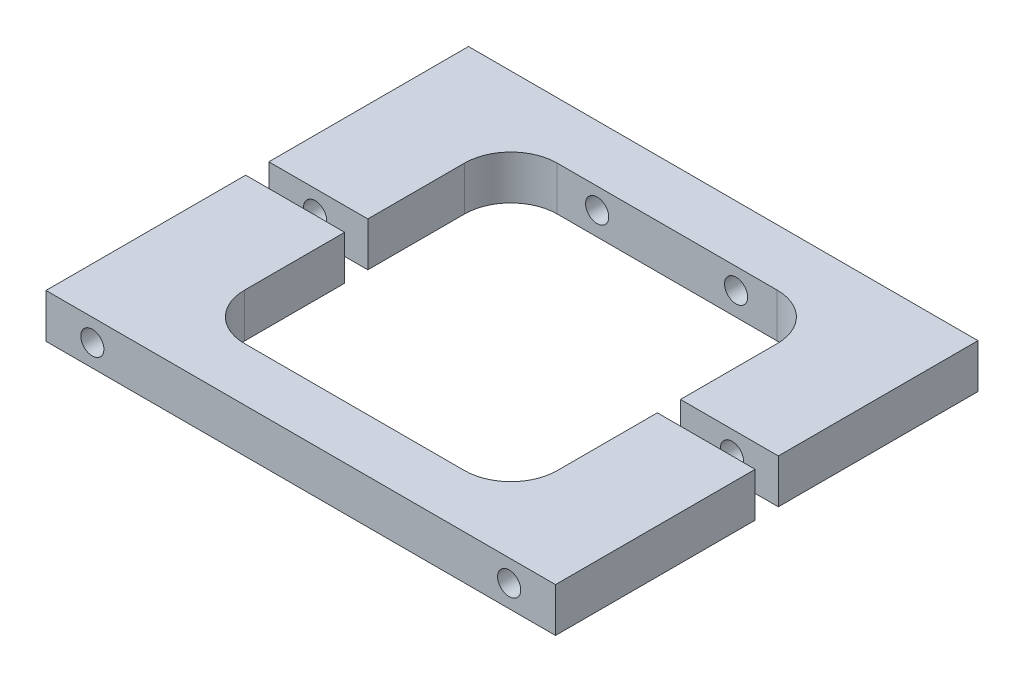
ISO-10303-21;
HEADER;
FILE_DESCRIPTION(('STEP AP214'),'2;1');
FILE_NAME('part.step','',(''),(''),'','','');
FILE_SCHEMA(('AUTOMOTIVE_DESIGN { 1 0 10303 214 1 1 1 1 }'));
ENDSEC;
DATA;
#1=APPLICATION_CONTEXT('core data for automotive mechanical design processes');
#2=APPLICATION_PROTOCOL_DEFINITION('international standard','automotive_design',2000,#1);
#3=PRODUCT_CONTEXT('',#1,'mechanical');
#4=PRODUCT('Part','Part','',(#3));
#5=PRODUCT_RELATED_PRODUCT_CATEGORY('part','',(#4));
#6=PRODUCT_DEFINITION_FORMATION('','',#4);
#7=PRODUCT_DEFINITION_CONTEXT('part definition',#1,'design');
#8=PRODUCT_DEFINITION('design','',#6,#7);
#9=PRODUCT_DEFINITION_SHAPE('','',#8);
#10=(LENGTH_UNIT() NAMED_UNIT(*) SI_UNIT(.MILLI.,.METRE.));
#11=(NAMED_UNIT(*) PLANE_ANGLE_UNIT() SI_UNIT($,.RADIAN.));
#12=(NAMED_UNIT(*) SI_UNIT($,.STERADIAN.) SOLID_ANGLE_UNIT());
#13=UNCERTAINTY_MEASURE_WITH_UNIT(LENGTH_MEASURE(1.E-05),#10,'distance_accuracy_value','');
#14=(GEOMETRIC_REPRESENTATION_CONTEXT(3) GLOBAL_UNCERTAINTY_ASSIGNED_CONTEXT((#13)) GLOBAL_UNIT_ASSIGNED_CONTEXT((#10,
#11,#12)) REPRESENTATION_CONTEXT('',''));
#15=CARTESIAN_POINT('',(0.,0.,0.));
#16=DIRECTION('',(0.,0.,1.));
#17=DIRECTION('',(1.,0.,0.));
#18=AXIS2_PLACEMENT_3D('',#15,#16,#17);
#19=CARTESIAN_POINT('',(-55.,0.,-46.22));
#20=DIRECTION('',(0.,0.,-1.));
#21=DIRECTION('',(-1.,0.,0.));
#22=AXIS2_PLACEMENT_3D('',#19,#20,#21);
#23=PLANE('',#22);
#24=CARTESIAN_POINT('',(45.,4.75999999999999,-46.22));
#25=DIRECTION('',(0.,0.,-1.));
#26=DIRECTION('',(-1.,0.,0.));
#27=AXIS2_PLACEMENT_3D('',#24,#25,#26);
#28=CIRCLE('',#27,2.5);
#29=CARTESIAN_POINT('',(42.5,4.75999999999999,-46.22));
#30=VERTEX_POINT('',#29);
#31=EDGE_CURVE('E476',#30,#30,#28,.T.);
#32=ORIENTED_EDGE('',*,*,#31,.F.);
#33=EDGE_LOOP('',(#32));
#34=FACE_BOUND('',#33,.T.);
#35=CARTESIAN_POINT('',(15.,4.99999999999999,-46.22));
#36=DIRECTION('',(0.,0.,-1.));
#37=DIRECTION('',(-1.,0.,0.));
#38=AXIS2_PLACEMENT_3D('',#35,#36,#37);
#39=CIRCLE('',#38,2.5);
#40=CARTESIAN_POINT('',(12.5,4.99999999999999,-46.22));
#41=VERTEX_POINT('',#40);
#42=EDGE_CURVE('E479',#41,#41,#39,.T.);
#43=ORIENTED_EDGE('',*,*,#42,.F.);
#44=EDGE_LOOP('',(#43));
#45=FACE_BOUND('',#44,.T.);
#46=CARTESIAN_POINT('',(-15.,4.99999999999999,-46.22));
#47=DIRECTION('',(0.,0.,1.));
#48=DIRECTION('',(1.,0.,0.));
#49=AXIS2_PLACEMENT_3D('',#46,#47,#48);
#50=CIRCLE('',#49,2.50000000000001);
#51=CARTESIAN_POINT('',(-12.5,4.99999999999999,-46.22));
#52=VERTEX_POINT('',#51);
#53=EDGE_CURVE('E187',#52,#52,#50,.T.);
#54=ORIENTED_EDGE('',*,*,#53,.T.);
#55=EDGE_LOOP('',(#54));
#56=FACE_BOUND('',#55,.T.);
#57=DIRECTION('',(-1.,0.,0.));
#58=VECTOR('',#57,1.);
#59=CARTESIAN_POINT('',(-55.,9.52,-46.22));
#60=LINE('',#59,#58);
#61=CARTESIAN_POINT('',(55.,9.52,-46.22));
#62=VERTEX_POINT('',#61);
#63=CARTESIAN_POINT('',(-55.,9.52,-46.22));
#64=VERTEX_POINT('',#63);
#65=EDGE_CURVE('E164',#62,#64,#60,.T.);
#66=ORIENTED_EDGE('',*,*,#65,.F.);
#67=DIRECTION('',(0.,1.,0.));
#68=VECTOR('',#67,1.);
#69=CARTESIAN_POINT('',(55.,0.,-46.22));
#70=LINE('',#69,#68);
#71=CARTESIAN_POINT('',(55.,0.,-46.22));
#72=VERTEX_POINT('',#71);
#73=EDGE_CURVE('E165',#72,#62,#70,.T.);
#74=ORIENTED_EDGE('',*,*,#73,.F.);
#75=DIRECTION('',(-1.,0.,0.));
#76=VECTOR('',#75,1.);
#77=CARTESIAN_POINT('',(-55.,0.,-46.22));
#78=LINE('',#77,#76);
#79=CARTESIAN_POINT('',(-55.,0.,-46.22));
#80=VERTEX_POINT('',#79);
#81=EDGE_CURVE('E212',#72,#80,#78,.T.);
#82=ORIENTED_EDGE('',*,*,#81,.T.);
#83=DIRECTION('',(0.,1.,0.));
#84=VECTOR('',#83,1.);
#85=CARTESIAN_POINT('',(-55.,0.,-46.22));
#86=LINE('',#85,#84);
#87=EDGE_CURVE('E208',#80,#64,#86,.T.);
#88=ORIENTED_EDGE('',*,*,#87,.T.);
#89=EDGE_LOOP('',(#66,#74,#82,#88));
#90=FACE_BOUND('',#89,.T.);
#91=CARTESIAN_POINT('',(-45.,4.75999999999999,-46.22));
#92=DIRECTION('',(0.,0.,1.));
#93=DIRECTION('',(1.,0.,0.));
#94=AXIS2_PLACEMENT_3D('',#91,#92,#93);
#95=CIRCLE('',#94,2.5);
#96=CARTESIAN_POINT('',(-42.5,4.75999999999999,-46.22));
#97=VERTEX_POINT('',#96);
#98=EDGE_CURVE('E193',#97,#97,#95,.T.);
#99=ORIENTED_EDGE('',*,*,#98,.T.);
#100=EDGE_LOOP('',(#99));
#101=FACE_BOUND('',#100,.T.);
#102=ADVANCED_FACE('F43',(#34,#45,#56,#90,#101),#23,.T.);
#103=CARTESIAN_POINT('',(-23.6275080575199,0.,-33.99498388496));
#104=DIRECTION('',(0.,0.,-1.));
#105=DIRECTION('',(-1.,0.,0.));
#106=AXIS2_PLACEMENT_3D('',#103,#104,#105);
#107=PLANE('',#106);
#108=CARTESIAN_POINT('',(15.,4.99999999999999,-33.99498388496));
#109=DIRECTION('',(0.,0.,-1.));
#110=DIRECTION('',(-1.,0.,0.));
#111=AXIS2_PLACEMENT_3D('',#108,#109,#110);
#112=CIRCLE('',#111,2.5);
#113=CARTESIAN_POINT('',(12.5,4.99999999999999,-33.99498388496));
#114=VERTEX_POINT('',#113);
#115=EDGE_CURVE('E47',#114,#114,#112,.T.);
#116=ORIENTED_EDGE('',*,*,#115,.T.);
#117=EDGE_LOOP('',(#116));
#118=FACE_BOUND('',#117,.T.);
#119=DIRECTION('',(-1.,0.,0.));
#120=VECTOR('',#119,1.);
#121=CARTESIAN_POINT('',(-23.6275080575199,9.52,-33.99498388496));
#122=LINE('',#121,#120);
#123=CARTESIAN_POINT('',(23.8724919424799,9.52,-33.99498388496));
#124=VERTEX_POINT('',#123);
#125=CARTESIAN_POINT('',(-23.6275080575199,9.52,-33.99498388496));
#126=VERTEX_POINT('',#125);
#127=EDGE_CURVE('E220',#124,#126,#122,.T.);
#128=ORIENTED_EDGE('',*,*,#127,.T.);
#129=DIRECTION('',(0.,1.,0.));
#130=VECTOR('',#129,1.);
#131=CARTESIAN_POINT('',(-23.6275080575199,0.,-33.99498388496));
#132=LINE('',#131,#130);
#133=CARTESIAN_POINT('',(-23.6275080575199,0.,-33.99498388496));
#134=VERTEX_POINT('',#133);
#135=EDGE_CURVE('E221',#134,#126,#132,.T.);
#136=ORIENTED_EDGE('',*,*,#135,.F.);
#137=DIRECTION('',(-1.,0.,0.));
#138=VECTOR('',#137,1.);
#139=CARTESIAN_POINT('',(-23.6275080575199,0.,-33.99498388496));
#140=LINE('',#139,#138);
#141=CARTESIAN_POINT('',(23.8724919424799,0.,-33.99498388496));
#142=VERTEX_POINT('',#141);
#143=EDGE_CURVE('E146',#142,#134,#140,.T.);
#144=ORIENTED_EDGE('',*,*,#143,.F.);
#145=DIRECTION('',(0.,1.,0.));
#146=VECTOR('',#145,1.);
#147=CARTESIAN_POINT('',(23.8724919424799,0.,-33.99498388496));
#148=LINE('',#147,#146);
#149=EDGE_CURVE('E144',#142,#124,#148,.T.);
#150=ORIENTED_EDGE('',*,*,#149,.T.);
#151=EDGE_LOOP('',(#128,#136,#144,#150));
#152=FACE_BOUND('',#151,.T.);
#153=CARTESIAN_POINT('',(-15.,4.99999999999999,-33.99498388496));
#154=DIRECTION('',(0.,0.,-1.));
#155=DIRECTION('',(-1.,0.,0.));
#156=AXIS2_PLACEMENT_3D('',#153,#154,#155);
#157=CIRCLE('',#156,2.50000000000001);
#158=CARTESIAN_POINT('',(-17.5,4.99999999999999,-33.99498388496));
#159=VERTEX_POINT('',#158);
#160=EDGE_CURVE('E184',#159,#159,#157,.F.);
#161=ORIENTED_EDGE('',*,*,#160,.F.);
#162=EDGE_LOOP('',(#161));
#163=FACE_BOUND('',#162,.T.);
#164=ADVANCED_FACE('F244',(#118,#152,#163),#107,.F.);
#165=CARTESIAN_POINT('',(-55.,9.52,-45.));
#166=DIRECTION('',(1.,0.,0.));
#167=DIRECTION('',(0.,0.,-1.));
#168=AXIS2_PLACEMENT_3D('',#165,#166,#167);
#169=PLANE('',#168);
#170=DIRECTION('',(0.,0.,1.));
#171=VECTOR('',#170,1.);
#172=CARTESIAN_POINT('',(-55.,0.,-45.));
#173=LINE('',#172,#171);
#174=CARTESIAN_POINT('',(-55.,0.,-3.11000000000001));
#175=VERTEX_POINT('',#174);
#176=EDGE_CURVE('E158',#80,#175,#173,.T.);
#177=ORIENTED_EDGE('',*,*,#176,.T.);
#178=DIRECTION('',(0.,1.,0.));
#179=VECTOR('',#178,1.);
#180=CARTESIAN_POINT('',(-55.,0.,-3.11000000000001));
#181=LINE('',#180,#179);
#182=CARTESIAN_POINT('',(-55.,9.52,-3.11000000000001));
#183=VERTEX_POINT('',#182);
#184=EDGE_CURVE('E84',#175,#183,#181,.T.);
#185=ORIENTED_EDGE('',*,*,#184,.T.);
#186=DIRECTION('',(0.,0.,1.));
#187=VECTOR('',#186,1.);
#188=CARTESIAN_POINT('',(-55.,9.52,-45.));
#189=LINE('',#188,#187);
#190=EDGE_CURVE('E161',#64,#183,#189,.T.);
#191=ORIENTED_EDGE('',*,*,#190,.F.);
#192=ORIENTED_EDGE('',*,*,#87,.F.);
#193=EDGE_LOOP('',(#177,#185,#191,#192));
#194=FACE_BOUND('',#193,.T.);
#195=ADVANCED_FACE('F45',(#194),#169,.F.);
#196=CARTESIAN_POINT('',(55.,9.52,-45.));
#197=DIRECTION('',(-1.,0.,0.));
#198=DIRECTION('',(0.,0.,1.));
#199=AXIS2_PLACEMENT_3D('',#196,#197,#198);
#200=PLANE('',#199);
#201=DIRECTION('',(0.,0.,-1.));
#202=VECTOR('',#201,1.);
#203=CARTESIAN_POINT('',(55.,9.52,-45.));
#204=LINE('',#203,#202);
#205=CARTESIAN_POINT('',(55.,9.52,-3.11000000000001));
#206=VERTEX_POINT('',#205);
#207=EDGE_CURVE('E162',#206,#62,#204,.T.);
#208=ORIENTED_EDGE('',*,*,#207,.F.);
#209=DIRECTION('',(0.,1.,0.));
#210=VECTOR('',#209,1.);
#211=CARTESIAN_POINT('',(55.,0.,-3.11000000000001));
#212=LINE('',#211,#210);
#213=CARTESIAN_POINT('',(55.,0.,-3.11000000000001));
#214=VERTEX_POINT('',#213);
#215=EDGE_CURVE('E53',#214,#206,#212,.T.);
#216=ORIENTED_EDGE('',*,*,#215,.F.);
#217=DIRECTION('',(0.,0.,-1.));
#218=VECTOR('',#217,1.);
#219=CARTESIAN_POINT('',(55.,0.,-45.));
#220=LINE('',#219,#218);
#221=EDGE_CURVE('E157',#214,#72,#220,.T.);
#222=ORIENTED_EDGE('',*,*,#221,.T.);
#223=ORIENTED_EDGE('',*,*,#73,.T.);
#224=EDGE_LOOP('',(#208,#216,#222,#223));
#225=FACE_BOUND('',#224,.T.);
#226=ADVANCED_FACE('F249',(#225),#200,.F.);
#227=CARTESIAN_POINT('',(-55.,9.52,45.));
#228=DIRECTION('',(0.,1.,0.));
#229=DIRECTION('',(0.,0.,1.));
#230=AXIS2_PLACEMENT_3D('',#227,#228,#229);
#231=PLANE('',#230);
#232=DIRECTION('',(-1.,0.,0.));
#233=VECTOR('',#232,1.);
#234=CARTESIAN_POINT('',(-55.,9.52,-3.11000000000001));
#235=LINE('',#234,#233);
#236=CARTESIAN_POINT('',(33.87249194248,9.52,-3.11000000000001));
#237=VERTEX_POINT('',#236);
#238=EDGE_CURVE('E12',#206,#237,#235,.T.);
#239=ORIENTED_EDGE('',*,*,#238,.F.);
#240=ORIENTED_EDGE('',*,*,#207,.T.);
#241=ORIENTED_EDGE('',*,*,#65,.T.);
#242=ORIENTED_EDGE('',*,*,#190,.T.);
#243=CARTESIAN_POINT('',(-33.62750805752,9.52,-3.11000000000001));
#244=VERTEX_POINT('',#243);
#245=EDGE_CURVE('E55',#244,#183,#235,.T.);
#246=ORIENTED_EDGE('',*,*,#245,.F.);
#247=DIRECTION('',(0.,0.,1.));
#248=VECTOR('',#247,1.);
#249=CARTESIAN_POINT('',(-33.62750805752,9.52,23.5050161150399));
#250=LINE('',#249,#248);
#251=CARTESIAN_POINT('',(-33.62750805752,9.52,-23.99498388496));
#252=VERTEX_POINT('',#251);
#253=EDGE_CURVE('E175',#252,#244,#250,.T.);
#254=ORIENTED_EDGE('',*,*,#253,.F.);
#255=CARTESIAN_POINT('',(-23.62750805752,9.52,-23.99498388496));
#256=DIRECTION('',(0.,1.,0.));
#257=DIRECTION('',(0.,0.,1.));
#258=AXIS2_PLACEMENT_3D('',#255,#256,#257);
#259=CIRCLE('',#258,10.);
#260=EDGE_CURVE('E211',#126,#252,#259,.T.);
#261=ORIENTED_EDGE('',*,*,#260,.F.);
#262=ORIENTED_EDGE('',*,*,#127,.F.);
#263=CARTESIAN_POINT('',(23.87249194248,9.52,-23.99498388496));
#264=DIRECTION('',(0.,1.,0.));
#265=DIRECTION('',(0.,0.,1.));
#266=AXIS2_PLACEMENT_3D('',#263,#264,#265);
#267=CIRCLE('',#266,10.);
#268=CARTESIAN_POINT('',(33.87249194248,9.52,-23.99498388496));
#269=VERTEX_POINT('',#268);
#270=EDGE_CURVE('E141',#269,#124,#267,.T.);
#271=ORIENTED_EDGE('',*,*,#270,.F.);
#272=DIRECTION('',(0.,0.,-1.));
#273=VECTOR('',#272,1.);
#274=CARTESIAN_POINT('',(33.87249194248,9.52,-23.99498388496));
#275=LINE('',#274,#273);
#276=EDGE_CURVE('E137',#237,#269,#275,.T.);
#277=ORIENTED_EDGE('',*,*,#276,.F.);
#278=EDGE_LOOP('',(#239,#240,#241,#242,#246,#254,#261,#262,#271,#277));
#279=FACE_BOUND('',#278,.T.);
#280=ADVANCED_FACE('F238',(#279),#231,.T.);
#281=CARTESIAN_POINT('',(-55.,0.,45.));
#282=DIRECTION('',(0.,1.,0.));
#283=DIRECTION('',(0.,0.,1.));
#284=AXIS2_PLACEMENT_3D('',#281,#282,#283);
#285=PLANE('',#284);
#286=ORIENTED_EDGE('',*,*,#221,.F.);
#287=DIRECTION('',(-1.,0.,0.));
#288=VECTOR('',#287,1.);
#289=CARTESIAN_POINT('',(-55.,0.,-3.11000000000001));
#290=LINE('',#289,#288);
#291=CARTESIAN_POINT('',(33.87249194248,0.,-3.11000000000001));
#292=VERTEX_POINT('',#291);
#293=EDGE_CURVE('E130',#214,#292,#290,.T.);
#294=ORIENTED_EDGE('',*,*,#293,.T.);
#295=DIRECTION('',(0.,0.,-1.));
#296=VECTOR('',#295,1.);
#297=CARTESIAN_POINT('',(33.87249194248,0.,-23.99498388496));
#298=LINE('',#297,#296);
#299=CARTESIAN_POINT('',(33.87249194248,0.,-23.99498388496));
#300=VERTEX_POINT('',#299);
#301=EDGE_CURVE('E123',#292,#300,#298,.T.);
#302=ORIENTED_EDGE('',*,*,#301,.T.);
#303=CARTESIAN_POINT('',(23.87249194248,0.,-23.99498388496));
#304=DIRECTION('',(0.,1.,0.));
#305=DIRECTION('',(0.,0.,1.));
#306=AXIS2_PLACEMENT_3D('',#303,#304,#305);
#307=CIRCLE('',#306,10.);
#308=EDGE_CURVE('E129',#300,#142,#307,.T.);
#309=ORIENTED_EDGE('',*,*,#308,.T.);
#310=ORIENTED_EDGE('',*,*,#143,.T.);
#311=CARTESIAN_POINT('',(-23.62750805752,0.,-23.99498388496));
#312=DIRECTION('',(0.,1.,0.));
#313=DIRECTION('',(0.,0.,1.));
#314=AXIS2_PLACEMENT_3D('',#311,#312,#313);
#315=CIRCLE('',#314,10.);
#316=CARTESIAN_POINT('',(-33.62750805752,0.,-23.99498388496));
#317=VERTEX_POINT('',#316);
#318=EDGE_CURVE('E148',#134,#317,#315,.T.);
#319=ORIENTED_EDGE('',*,*,#318,.T.);
#320=DIRECTION('',(0.,0.,1.));
#321=VECTOR('',#320,1.);
#322=CARTESIAN_POINT('',(-33.62750805752,0.,23.5050161150399));
#323=LINE('',#322,#321);
#324=CARTESIAN_POINT('',(-33.62750805752,0.,-3.11000000000001));
#325=VERTEX_POINT('',#324);
#326=EDGE_CURVE('E154',#317,#325,#323,.T.);
#327=ORIENTED_EDGE('',*,*,#326,.T.);
#328=EDGE_CURVE('E87',#325,#175,#290,.T.);
#329=ORIENTED_EDGE('',*,*,#328,.T.);
#330=ORIENTED_EDGE('',*,*,#176,.F.);
#331=ORIENTED_EDGE('',*,*,#81,.F.);
#332=EDGE_LOOP('',(#286,#294,#302,#309,#310,#319,#327,#329,#330,#331));
#333=FACE_BOUND('',#332,.T.);
#334=ADVANCED_FACE('F126',(#333),#285,.F.);
#335=CARTESIAN_POINT('',(33.87249194248,0.,-23.99498388496));
#336=DIRECTION('',(1.,0.,0.));
#337=DIRECTION('',(0.,0.,-1.));
#338=AXIS2_PLACEMENT_3D('',#335,#336,#337);
#339=PLANE('',#338);
#340=ORIENTED_EDGE('',*,*,#301,.F.);
#341=DIRECTION('',(0.,1.,0.));
#342=VECTOR('',#341,1.);
#343=CARTESIAN_POINT('',(33.87249194248,0.,-3.11000000000001));
#344=LINE('',#343,#342);
#345=EDGE_CURVE('E62',#292,#237,#344,.T.);
#346=ORIENTED_EDGE('',*,*,#345,.T.);
#347=ORIENTED_EDGE('',*,*,#276,.T.);
#348=DIRECTION('',(0.,1.,0.));
#349=VECTOR('',#348,1.);
#350=CARTESIAN_POINT('',(33.87249194248,0.,-23.99498388496));
#351=LINE('',#350,#349);
#352=EDGE_CURVE('E134',#300,#269,#351,.T.);
#353=ORIENTED_EDGE('',*,*,#352,.F.);
#354=EDGE_LOOP('',(#340,#346,#347,#353));
#355=FACE_BOUND('',#354,.T.);
#356=ADVANCED_FACE('F135',(#355),#339,.F.);
#357=CARTESIAN_POINT('',(-33.62750805752,0.,23.5050161150399));
#358=DIRECTION('',(-1.,0.,0.));
#359=DIRECTION('',(0.,0.,1.));
#360=AXIS2_PLACEMENT_3D('',#357,#358,#359);
#361=PLANE('',#360);
#362=ORIENTED_EDGE('',*,*,#253,.T.);
#363=DIRECTION('',(0.,-1.,0.));
#364=VECTOR('',#363,1.);
#365=CARTESIAN_POINT('',(-33.62750805752,0.,-3.11000000000001));
#366=LINE('',#365,#364);
#367=EDGE_CURVE('E178',#244,#325,#366,.T.);
#368=ORIENTED_EDGE('',*,*,#367,.T.);
#369=ORIENTED_EDGE('',*,*,#326,.F.);
#370=DIRECTION('',(0.,1.,0.));
#371=VECTOR('',#370,1.);
#372=CARTESIAN_POINT('',(-33.62750805752,0.,-23.99498388496));
#373=LINE('',#372,#371);
#374=EDGE_CURVE('E205',#317,#252,#373,.T.);
#375=ORIENTED_EDGE('',*,*,#374,.T.);
#376=EDGE_LOOP('',(#362,#368,#369,#375));
#377=FACE_BOUND('',#376,.T.);
#378=ADVANCED_FACE('F235',(#377),#361,.F.);
#379=CARTESIAN_POINT('',(-23.62750805752,0.,-23.99498388496));
#380=DIRECTION('',(0.,1.,0.));
#381=DIRECTION('',(0.,0.,1.));
#382=AXIS2_PLACEMENT_3D('',#379,#380,#381);
#383=CYLINDRICAL_SURFACE('',#382,10.);
#384=ORIENTED_EDGE('',*,*,#260,.T.);
#385=ORIENTED_EDGE('',*,*,#374,.F.);
#386=ORIENTED_EDGE('',*,*,#318,.F.);
#387=ORIENTED_EDGE('',*,*,#135,.T.);
#388=EDGE_LOOP('',(#384,#385,#386,#387));
#389=FACE_BOUND('',#388,.T.);
#390=ADVANCED_FACE('F228',(#389),#383,.F.);
#391=CARTESIAN_POINT('',(23.87249194248,0.,-23.99498388496));
#392=DIRECTION('',(0.,1.,0.));
#393=DIRECTION('',(0.,0.,1.));
#394=AXIS2_PLACEMENT_3D('',#391,#392,#393);
#395=CYLINDRICAL_SURFACE('',#394,10.);
#396=ORIENTED_EDGE('',*,*,#270,.T.);
#397=ORIENTED_EDGE('',*,*,#149,.F.);
#398=ORIENTED_EDGE('',*,*,#308,.F.);
#399=ORIENTED_EDGE('',*,*,#352,.T.);
#400=EDGE_LOOP('',(#396,#397,#398,#399));
#401=FACE_BOUND('',#400,.T.);
#402=ADVANCED_FACE('F143',(#401),#395,.F.);
#403=CARTESIAN_POINT('',(-55.,0.,-3.11000000000001));
#404=DIRECTION('',(0.,0.,-1.));
#405=DIRECTION('',(-1.,0.,0.));
#406=AXIS2_PLACEMENT_3D('',#403,#404,#405);
#407=PLANE('',#406);
#408=CARTESIAN_POINT('',(-45.,4.76,-3.11000000000001));
#409=DIRECTION('',(0.,0.,-1.));
#410=DIRECTION('',(-1.,0.,0.));
#411=AXIS2_PLACEMENT_3D('',#408,#409,#410);
#412=CIRCLE('',#411,2.5);
#413=CARTESIAN_POINT('',(-47.5,4.76,-3.11000000000001));
#414=VERTEX_POINT('',#413);
#415=EDGE_CURVE('E170',#414,#414,#412,.T.);
#416=ORIENTED_EDGE('',*,*,#415,.T.);
#417=EDGE_LOOP('',(#416));
#418=FACE_BOUND('',#417,.T.);
#419=ORIENTED_EDGE('',*,*,#245,.T.);
#420=ORIENTED_EDGE('',*,*,#184,.F.);
#421=ORIENTED_EDGE('',*,*,#328,.F.);
#422=ORIENTED_EDGE('',*,*,#367,.F.);
#423=EDGE_LOOP('',(#419,#420,#421,#422));
#424=FACE_BOUND('',#423,.T.);
#425=ADVANCED_FACE('F239',(#418,#424),#407,.F.);
#426=CARTESIAN_POINT('',(45.,4.76,-3.11000000000001));
#427=DIRECTION('',(0.,0.,-1.));
#428=DIRECTION('',(-1.,0.,0.));
#429=AXIS2_PLACEMENT_3D('',#426,#427,#428);
#430=CIRCLE('',#429,2.5);
#431=CARTESIAN_POINT('',(42.5,4.76,-3.11000000000001));
#432=VERTEX_POINT('',#431);
#433=EDGE_CURVE('E179',#432,#432,#430,.T.);
#434=ORIENTED_EDGE('',*,*,#433,.T.);
#435=EDGE_LOOP('',(#434));
#436=FACE_BOUND('',#435,.T.);
#437=ORIENTED_EDGE('',*,*,#293,.F.);
#438=ORIENTED_EDGE('',*,*,#215,.T.);
#439=ORIENTED_EDGE('',*,*,#238,.T.);
#440=ORIENTED_EDGE('',*,*,#345,.F.);
#441=EDGE_LOOP('',(#437,#438,#439,#440));
#442=FACE_BOUND('',#441,.T.);
#443=ADVANCED_FACE('F292',(#436,#442),#407,.F.);
#444=CARTESIAN_POINT('',(45.,4.76,-25.));
#445=DIRECTION('',(0.,0.,1.));
#446=DIRECTION('',(1.,0.,0.));
#447=AXIS2_PLACEMENT_3D('',#444,#445,#446);
#448=CYLINDRICAL_SURFACE('',#447,2.5);
#449=CARTESIAN_POINT('',(45.,4.76,-25.));
#450=DIRECTION('',(0.,0.,1.));
#451=DIRECTION('',(-1.,0.,0.));
#452=AXIS2_PLACEMENT_3D('',#449,#450,#451);
#453=CIRCLE('',#452,2.5);
#454=CARTESIAN_POINT('',(42.5,4.76,-25.));
#455=VERTEX_POINT('',#454);
#456=EDGE_CURVE('E186',#455,#455,#453,.T.);
#457=ORIENTED_EDGE('',*,*,#456,.F.);
#458=EDGE_LOOP('',(#457));
#459=FACE_BOUND('',#458,.T.);
#460=ORIENTED_EDGE('',*,*,#433,.F.);
#461=EDGE_LOOP('',(#460));
#462=FACE_BOUND('',#461,.T.);
#463=ADVANCED_FACE('F289',(#459,#462),#448,.F.);
#464=CARTESIAN_POINT('',(45.,4.76,-25.));
#465=DIRECTION('',(0.,0.,-1.));
#466=DIRECTION('',(-1.,0.,0.));
#467=AXIS2_PLACEMENT_3D('',#464,#465,#466);
#468=PLANE('',#467);
#469=ORIENTED_EDGE('',*,*,#456,.T.);
#470=EDGE_LOOP('',(#469));
#471=FACE_BOUND('',#470,.T.);
#472=ADVANCED_FACE('F285',(#471),#468,.F.);
#473=CARTESIAN_POINT('',(-45.,4.76,-25.));
#474=DIRECTION('',(0.,0.,1.));
#475=DIRECTION('',(1.,0.,0.));
#476=AXIS2_PLACEMENT_3D('',#473,#474,#475);
#477=CYLINDRICAL_SURFACE('',#476,2.5);
#478=CARTESIAN_POINT('',(-45.,4.76,-25.));
#479=DIRECTION('',(0.,0.,1.));
#480=DIRECTION('',(1.,0.,0.));
#481=AXIS2_PLACEMENT_3D('',#478,#479,#480);
#482=CIRCLE('',#481,2.5);
#483=CARTESIAN_POINT('',(-42.5,4.76,-25.));
#484=VERTEX_POINT('',#483);
#485=EDGE_CURVE('E182',#484,#484,#482,.T.);
#486=ORIENTED_EDGE('',*,*,#485,.F.);
#487=EDGE_LOOP('',(#486));
#488=FACE_BOUND('',#487,.T.);
#489=ORIENTED_EDGE('',*,*,#415,.F.);
#490=EDGE_LOOP('',(#489));
#491=FACE_BOUND('',#490,.T.);
#492=ADVANCED_FACE('F281',(#488,#491),#477,.F.);
#493=CARTESIAN_POINT('',(-45.,4.76,-25.));
#494=DIRECTION('',(0.,0.,1.));
#495=DIRECTION('',(1.,0.,0.));
#496=AXIS2_PLACEMENT_3D('',#493,#494,#495);
#497=PLANE('',#496);
#498=ORIENTED_EDGE('',*,*,#485,.T.);
#499=EDGE_LOOP('',(#498));
#500=FACE_BOUND('',#499,.T.);
#501=ADVANCED_FACE('F272',(#500),#497,.T.);
#502=CARTESIAN_POINT('',(-15.,4.99999999999999,-31.22));
#503=DIRECTION('',(0.,0.,-1.));
#504=DIRECTION('',(-1.,0.,0.));
#505=AXIS2_PLACEMENT_3D('',#502,#503,#504);
#506=CYLINDRICAL_SURFACE('',#505,2.50000000000001);
#507=ORIENTED_EDGE('',*,*,#53,.F.);
#508=EDGE_LOOP('',(#507));
#509=FACE_BOUND('',#508,.T.);
#510=ORIENTED_EDGE('',*,*,#160,.T.);
#511=EDGE_LOOP('',(#510));
#512=FACE_BOUND('',#511,.T.);
#513=ADVANCED_FACE('F262',(#509,#512),#506,.F.);
#514=CARTESIAN_POINT('',(-45.,4.75999999999999,-31.22));
#515=DIRECTION('',(0.,0.,-1.));
#516=DIRECTION('',(-1.,0.,0.));
#517=AXIS2_PLACEMENT_3D('',#514,#515,#516);
#518=CYLINDRICAL_SURFACE('',#517,2.5);
#519=CARTESIAN_POINT('',(-45.,4.75999999999999,-31.22));
#520=DIRECTION('',(0.,0.,1.));
#521=DIRECTION('',(1.,0.,0.));
#522=AXIS2_PLACEMENT_3D('',#519,#520,#521);
#523=CIRCLE('',#522,2.5);
#524=CARTESIAN_POINT('',(-42.5,4.75999999999999,-31.22));
#525=VERTEX_POINT('',#524);
#526=EDGE_CURVE('E198',#525,#525,#523,.T.);
#527=ORIENTED_EDGE('',*,*,#526,.T.);
#528=EDGE_LOOP('',(#527));
#529=FACE_BOUND('',#528,.T.);
#530=ORIENTED_EDGE('',*,*,#98,.F.);
#531=EDGE_LOOP('',(#530));
#532=FACE_BOUND('',#531,.T.);
#533=ADVANCED_FACE('F259',(#529,#532),#518,.F.);
#534=CARTESIAN_POINT('',(-45.,4.75999999999999,-31.22));
#535=DIRECTION('',(0.,0.,1.));
#536=DIRECTION('',(1.,0.,0.));
#537=AXIS2_PLACEMENT_3D('',#534,#535,#536);
#538=PLANE('',#537);
#539=ORIENTED_EDGE('',*,*,#526,.F.);
#540=EDGE_LOOP('',(#539));
#541=FACE_BOUND('',#540,.T.);
#542=ADVANCED_FACE('F261',(#541),#538,.F.);
#543=CARTESIAN_POINT('',(15.,4.99999999999999,-31.22));
#544=DIRECTION('',(0.,0.,-1.));
#545=DIRECTION('',(-1.,0.,0.));
#546=AXIS2_PLACEMENT_3D('',#543,#544,#545);
#547=CYLINDRICAL_SURFACE('',#546,2.5);
#548=ORIENTED_EDGE('',*,*,#42,.T.);
#549=EDGE_LOOP('',(#548));
#550=FACE_BOUND('',#549,.T.);
#551=ORIENTED_EDGE('',*,*,#115,.F.);
#552=EDGE_LOOP('',(#551));
#553=FACE_BOUND('',#552,.T.);
#554=ADVANCED_FACE('F269',(#550,#553),#547,.F.);
#555=CARTESIAN_POINT('',(45.,4.75999999999999,-31.22));
#556=DIRECTION('',(0.,0.,-1.));
#557=DIRECTION('',(-1.,0.,0.));
#558=AXIS2_PLACEMENT_3D('',#555,#556,#557);
#559=CYLINDRICAL_SURFACE('',#558,2.5);
#560=CARTESIAN_POINT('',(45.,4.75999999999999,-31.22));
#561=DIRECTION('',(0.,0.,-1.));
#562=DIRECTION('',(-1.,0.,0.));
#563=AXIS2_PLACEMENT_3D('',#560,#561,#562);
#564=CIRCLE('',#563,2.5);
#565=CARTESIAN_POINT('',(42.5,4.75999999999999,-31.22));
#566=VERTEX_POINT('',#565);
#567=EDGE_CURVE('E475',#566,#566,#564,.T.);
#568=ORIENTED_EDGE('',*,*,#567,.F.);
#569=EDGE_LOOP('',(#568));
#570=FACE_BOUND('',#569,.T.);
#571=ORIENTED_EDGE('',*,*,#31,.T.);
#572=EDGE_LOOP('',(#571));
#573=FACE_BOUND('',#572,.T.);
#574=ADVANCED_FACE('F451',(#570,#573),#559,.F.);
#575=CARTESIAN_POINT('',(45.,4.75999999999999,-31.22));
#576=DIRECTION('',(0.,0.,-1.));
#577=DIRECTION('',(-1.,0.,0.));
#578=AXIS2_PLACEMENT_3D('',#575,#576,#577);
#579=PLANE('',#578);
#580=ORIENTED_EDGE('',*,*,#567,.T.);
#581=EDGE_LOOP('',(#580));
#582=FACE_BOUND('',#581,.T.);
#583=ADVANCED_FACE('F460',(#582),#579,.T.);
#584=CLOSED_SHELL('',(#102,#164,#195,#226,#280,#334,#356,#378,#390,#402,#425,#443,#463,#472,
#492,#501,#513,#533,#542,#554,#574,#583));
#585=MANIFOLD_SOLID_BREP('B2',#584);
#586=CARTESIAN_POINT('',(-55.,9.52,45.));
#587=DIRECTION('',(0.,0.,-1.));
#588=DIRECTION('',(-1.,0.,0.));
#589=AXIS2_PLACEMENT_3D('',#586,#587,#588);
#590=PLANE('',#589);
#591=CARTESIAN_POINT('',(-45.,4.76,45.));
#592=DIRECTION('',(0.,0.,1.));
#593=DIRECTION('',(1.,0.,0.));
#594=AXIS2_PLACEMENT_3D('',#591,#592,#593);
#595=CIRCLE('',#594,2.5);
#596=CARTESIAN_POINT('',(-42.5,4.76,45.));
#597=VERTEX_POINT('',#596);
#598=EDGE_CURVE('E613',#597,#597,#595,.T.);
#599=ORIENTED_EDGE('',*,*,#598,.F.);
#600=EDGE_LOOP('',(#599));
#601=FACE_BOUND('',#600,.T.);
#602=CARTESIAN_POINT('',(45.,4.76,45.));
#603=DIRECTION('',(0.,0.,1.));
#604=DIRECTION('',(-1.,0.,0.));
#605=AXIS2_PLACEMENT_3D('',#602,#603,#604);
#606=CIRCLE('',#605,2.5);
#607=CARTESIAN_POINT('',(42.5,4.76,45.));
#608=VERTEX_POINT('',#607);
#609=EDGE_CURVE('E619',#608,#608,#606,.T.);
#610=ORIENTED_EDGE('',*,*,#609,.F.);
#611=EDGE_LOOP('',(#610));
#612=FACE_BOUND('',#611,.T.);
#613=DIRECTION('',(1.,0.,0.));
#614=VECTOR('',#613,1.);
#615=CARTESIAN_POINT('',(-55.,0.,45.));
#616=LINE('',#615,#614);
#617=CARTESIAN_POINT('',(-55.,0.,45.));
#618=VERTEX_POINT('',#617);
#619=CARTESIAN_POINT('',(55.,0.,45.));
#620=VERTEX_POINT('',#619);
#621=EDGE_CURVE('E594',#618,#620,#616,.T.);
#622=ORIENTED_EDGE('',*,*,#621,.T.);
#623=DIRECTION('',(0.,-1.,0.));
#624=VECTOR('',#623,1.);
#625=CARTESIAN_POINT('',(55.,9.52,45.));
#626=LINE('',#625,#624);
#627=CARTESIAN_POINT('',(55.,9.52,45.));
#628=VERTEX_POINT('',#627);
#629=EDGE_CURVE('E608',#628,#620,#626,.T.);
#630=ORIENTED_EDGE('',*,*,#629,.F.);
#631=DIRECTION('',(1.,0.,0.));
#632=VECTOR('',#631,1.);
#633=CARTESIAN_POINT('',(-55.,9.52,45.));
#634=LINE('',#633,#632);
#635=CARTESIAN_POINT('',(-55.,9.52,45.));
#636=VERTEX_POINT('',#635);
#637=EDGE_CURVE('E665',#636,#628,#634,.T.);
#638=ORIENTED_EDGE('',*,*,#637,.F.);
#639=DIRECTION('',(0.,-1.,0.));
#640=VECTOR('',#639,1.);
#641=CARTESIAN_POINT('',(-55.,9.52,45.));
#642=LINE('',#641,#640);
#643=EDGE_CURVE('E509',#636,#618,#642,.T.);
#644=ORIENTED_EDGE('',*,*,#643,.T.);
#645=EDGE_LOOP('',(#622,#630,#638,#644));
#646=FACE_BOUND('',#645,.T.);
#647=ADVANCED_FACE('F500',(#601,#612,#646),#590,.F.);
#648=CARTESIAN_POINT('',(23.87249194248,0.,33.50501611504));
#649=DIRECTION('',(0.,0.,1.));
#650=DIRECTION('',(1.,0.,0.));
#651=AXIS2_PLACEMENT_3D('',#648,#649,#650);
#652=PLANE('',#651);
#653=DIRECTION('',(1.,0.,0.));
#654=VECTOR('',#653,1.);
#655=CARTESIAN_POINT('',(23.87249194248,9.52,33.50501611504));
#656=LINE('',#655,#654);
#657=CARTESIAN_POINT('',(-23.6275080575199,9.52,33.50501611504));
#658=VERTEX_POINT('',#657);
#659=CARTESIAN_POINT('',(23.87249194248,9.52,33.50501611504));
#660=VERTEX_POINT('',#659);
#661=EDGE_CURVE('E652',#658,#660,#656,.T.);
#662=ORIENTED_EDGE('',*,*,#661,.T.);
#663=DIRECTION('',(0.,1.,0.));
#664=VECTOR('',#663,1.);
#665=CARTESIAN_POINT('',(23.87249194248,0.,33.50501611504));
#666=LINE('',#665,#664);
#667=CARTESIAN_POINT('',(23.87249194248,0.,33.50501611504));
#668=VERTEX_POINT('',#667);
#669=EDGE_CURVE('E600',#668,#660,#666,.T.);
#670=ORIENTED_EDGE('',*,*,#669,.F.);
#671=DIRECTION('',(1.,0.,0.));
#672=VECTOR('',#671,1.);
#673=CARTESIAN_POINT('',(23.87249194248,0.,33.50501611504));
#674=LINE('',#673,#672);
#675=CARTESIAN_POINT('',(-23.6275080575199,0.,33.50501611504));
#676=VERTEX_POINT('',#675);
#677=EDGE_CURVE('E638',#676,#668,#674,.T.);
#678=ORIENTED_EDGE('',*,*,#677,.F.);
#679=DIRECTION('',(0.,1.,0.));
#680=VECTOR('',#679,1.);
#681=CARTESIAN_POINT('',(-23.6275080575199,0.,33.50501611504));
#682=LINE('',#681,#680);
#683=EDGE_CURVE('E661',#676,#658,#682,.T.);
#684=ORIENTED_EDGE('',*,*,#683,.T.);
#685=EDGE_LOOP('',(#662,#670,#678,#684));
#686=FACE_BOUND('',#685,.T.);
#687=ADVANCED_FACE('F688',(#686),#652,.F.);
#688=CARTESIAN_POINT('',(23.87249194248,0.,23.50501611504));
#689=DIRECTION('',(0.,1.,0.));
#690=DIRECTION('',(0.,0.,1.));
#691=AXIS2_PLACEMENT_3D('',#688,#689,#690);
#692=CYLINDRICAL_SURFACE('',#691,10.);
#693=CARTESIAN_POINT('',(23.87249194248,9.52,23.50501611504));
#694=DIRECTION('',(0.,1.,0.));
#695=DIRECTION('',(0.,0.,1.));
#696=AXIS2_PLACEMENT_3D('',#693,#694,#695);
#697=CIRCLE('',#696,10.);
#698=CARTESIAN_POINT('',(33.87249194248,9.52,23.5050161150399));
#699=VERTEX_POINT('',#698);
#700=EDGE_CURVE('E655',#660,#699,#697,.T.);
#701=ORIENTED_EDGE('',*,*,#700,.T.);
#702=DIRECTION('',(0.,1.,0.));
#703=VECTOR('',#702,1.);
#704=CARTESIAN_POINT('',(33.87249194248,0.,23.5050161150399));
#705=LINE('',#704,#703);
#706=CARTESIAN_POINT('',(33.87249194248,0.,23.5050161150399));
#707=VERTEX_POINT('',#706);
#708=EDGE_CURVE('E596',#707,#699,#705,.T.);
#709=ORIENTED_EDGE('',*,*,#708,.F.);
#710=CARTESIAN_POINT('',(23.87249194248,0.,23.50501611504));
#711=DIRECTION('',(0.,1.,0.));
#712=DIRECTION('',(0.,0.,1.));
#713=AXIS2_PLACEMENT_3D('',#710,#711,#712);
#714=CIRCLE('',#713,10.);
#715=EDGE_CURVE('E641',#668,#707,#714,.T.);
#716=ORIENTED_EDGE('',*,*,#715,.F.);
#717=ORIENTED_EDGE('',*,*,#669,.T.);
#718=EDGE_LOOP('',(#701,#709,#716,#717));
#719=FACE_BOUND('',#718,.T.);
#720=ADVANCED_FACE('F685',(#719),#692,.F.);
#721=CARTESIAN_POINT('',(-23.62750805752,0.,23.50501611504));
#722=DIRECTION('',(0.,1.,0.));
#723=DIRECTION('',(0.,0.,1.));
#724=AXIS2_PLACEMENT_3D('',#721,#722,#723);
#725=CYLINDRICAL_SURFACE('',#724,10.);
#726=CARTESIAN_POINT('',(-23.62750805752,9.52,23.50501611504));
#727=DIRECTION('',(0.,1.,0.));
#728=DIRECTION('',(0.,0.,1.));
#729=AXIS2_PLACEMENT_3D('',#726,#727,#728);
#730=CIRCLE('',#729,10.);
#731=CARTESIAN_POINT('',(-33.62750805752,9.52,23.5050161150399));
#732=VERTEX_POINT('',#731);
#733=EDGE_CURVE('E649',#732,#658,#730,.T.);
#734=ORIENTED_EDGE('',*,*,#733,.T.);
#735=ORIENTED_EDGE('',*,*,#683,.F.);
#736=CARTESIAN_POINT('',(-23.62750805752,0.,23.50501611504));
#737=DIRECTION('',(0.,1.,0.));
#738=DIRECTION('',(0.,0.,1.));
#739=AXIS2_PLACEMENT_3D('',#736,#737,#738);
#740=CIRCLE('',#739,10.);
#741=CARTESIAN_POINT('',(-33.62750805752,0.,23.5050161150399));
#742=VERTEX_POINT('',#741);
#743=EDGE_CURVE('E634',#742,#676,#740,.T.);
#744=ORIENTED_EDGE('',*,*,#743,.F.);
#745=DIRECTION('',(0.,1.,0.));
#746=VECTOR('',#745,1.);
#747=CARTESIAN_POINT('',(-33.62750805752,0.,23.5050161150399));
#748=LINE('',#747,#746);
#749=EDGE_CURVE('E647',#742,#732,#748,.T.);
#750=ORIENTED_EDGE('',*,*,#749,.T.);
#751=EDGE_LOOP('',(#734,#735,#744,#750));
#752=FACE_BOUND('',#751,.T.);
#753=ADVANCED_FACE('F691',(#752),#725,.F.);
#754=CARTESIAN_POINT('',(33.87249194248,0.,-23.99498388496));
#755=DIRECTION('',(1.,0.,0.));
#756=DIRECTION('',(0.,0.,-1.));
#757=AXIS2_PLACEMENT_3D('',#754,#755,#756);
#758=PLANE('',#757);
#759=DIRECTION('',(0.,0.,-1.));
#760=VECTOR('',#759,1.);
#761=CARTESIAN_POINT('',(33.87249194248,9.52,-23.99498388496));
#762=LINE('',#761,#760);
#763=CARTESIAN_POINT('',(33.87249194248,9.52,1.88999999999999));
#764=VERTEX_POINT('',#763);
#765=EDGE_CURVE('E635',#699,#764,#762,.T.);
#766=ORIENTED_EDGE('',*,*,#765,.T.);
#767=DIRECTION('',(0.,-1.,0.));
#768=VECTOR('',#767,1.);
#769=CARTESIAN_POINT('',(33.87249194248,0.,1.88999999999999));
#770=LINE('',#769,#768);
#771=CARTESIAN_POINT('',(33.87249194248,0.,1.88999999999999));
#772=VERTEX_POINT('',#771);
#773=EDGE_CURVE('E628',#764,#772,#770,.T.);
#774=ORIENTED_EDGE('',*,*,#773,.T.);
#775=DIRECTION('',(0.,0.,-1.));
#776=VECTOR('',#775,1.);
#777=CARTESIAN_POINT('',(33.87249194248,0.,-23.99498388496));
#778=LINE('',#777,#776);
#779=EDGE_CURVE('E644',#707,#772,#778,.T.);
#780=ORIENTED_EDGE('',*,*,#779,.F.);
#781=ORIENTED_EDGE('',*,*,#708,.T.);
#782=EDGE_LOOP('',(#766,#774,#780,#781));
#783=FACE_BOUND('',#782,.T.);
#784=ADVANCED_FACE('F680',(#783),#758,.F.);
#785=CARTESIAN_POINT('',(-33.62750805752,0.,23.5050161150399));
#786=DIRECTION('',(-1.,0.,0.));
#787=DIRECTION('',(0.,0.,1.));
#788=AXIS2_PLACEMENT_3D('',#785,#786,#787);
#789=PLANE('',#788);
#790=DIRECTION('',(0.,0.,1.));
#791=VECTOR('',#790,1.);
#792=CARTESIAN_POINT('',(-33.62750805752,0.,23.5050161150399));
#793=LINE('',#792,#791);
#794=CARTESIAN_POINT('',(-33.62750805752,0.,1.88999999999999));
#795=VERTEX_POINT('',#794);
#796=EDGE_CURVE('E632',#795,#742,#793,.T.);
#797=ORIENTED_EDGE('',*,*,#796,.F.);
#798=DIRECTION('',(0.,1.,0.));
#799=VECTOR('',#798,1.);
#800=CARTESIAN_POINT('',(-33.62750805752,0.,1.88999999999999));
#801=LINE('',#800,#799);
#802=CARTESIAN_POINT('',(-33.62750805752,9.52,1.88999999999999));
#803=VERTEX_POINT('',#802);
#804=EDGE_CURVE('E41',#795,#803,#801,.T.);
#805=ORIENTED_EDGE('',*,*,#804,.T.);
#806=DIRECTION('',(0.,0.,1.));
#807=VECTOR('',#806,1.);
#808=CARTESIAN_POINT('',(-33.62750805752,9.52,23.5050161150399));
#809=LINE('',#808,#807);
#810=EDGE_CURVE('E631',#803,#732,#809,.T.);
#811=ORIENTED_EDGE('',*,*,#810,.T.);
#812=ORIENTED_EDGE('',*,*,#749,.F.);
#813=EDGE_LOOP('',(#797,#805,#811,#812));
#814=FACE_BOUND('',#813,.T.);
#815=ADVANCED_FACE('F695',(#814),#789,.F.);
#816=CARTESIAN_POINT('',(-55.,0.,45.));
#817=DIRECTION('',(0.,1.,0.));
#818=DIRECTION('',(0.,0.,1.));
#819=AXIS2_PLACEMENT_3D('',#816,#817,#818);
#820=PLANE('',#819);
#821=DIRECTION('',(0.,0.,1.));
#822=VECTOR('',#821,1.);
#823=CARTESIAN_POINT('',(-55.,0.,-45.));
#824=LINE('',#823,#822);
#825=CARTESIAN_POINT('',(-55.,0.,1.88999999999999));
#826=VERTEX_POINT('',#825);
#827=EDGE_CURVE('E587',#826,#618,#824,.T.);
#828=ORIENTED_EDGE('',*,*,#827,.F.);
#829=DIRECTION('',(1.,0.,0.));
#830=VECTOR('',#829,1.);
#831=CARTESIAN_POINT('',(-55.,0.,1.88999999999999));
#832=LINE('',#831,#830);
#833=EDGE_CURVE('E576',#826,#795,#832,.T.);
#834=ORIENTED_EDGE('',*,*,#833,.T.);
#835=ORIENTED_EDGE('',*,*,#796,.T.);
#836=ORIENTED_EDGE('',*,*,#743,.T.);
#837=ORIENTED_EDGE('',*,*,#677,.T.);
#838=ORIENTED_EDGE('',*,*,#715,.T.);
#839=ORIENTED_EDGE('',*,*,#779,.T.);
#840=CARTESIAN_POINT('',(55.,0.,1.88999999999999));
#841=VERTEX_POINT('',#840);
#842=EDGE_CURVE('E517',#772,#841,#832,.T.);
#843=ORIENTED_EDGE('',*,*,#842,.T.);
#844=DIRECTION('',(0.,0.,-1.));
#845=VECTOR('',#844,1.);
#846=CARTESIAN_POINT('',(55.,0.,-45.));
#847=LINE('',#846,#845);
#848=EDGE_CURVE('E598',#620,#841,#847,.T.);
#849=ORIENTED_EDGE('',*,*,#848,.F.);
#850=ORIENTED_EDGE('',*,*,#621,.F.);
#851=EDGE_LOOP('',(#828,#834,#835,#836,#837,#838,#839,#843,#849,#850));
#852=FACE_BOUND('',#851,.T.);
#853=ADVANCED_FACE('F592',(#852),#820,.F.);
#854=CARTESIAN_POINT('',(-55.,9.52,45.));
#855=DIRECTION('',(0.,1.,0.));
#856=DIRECTION('',(0.,0.,1.));
#857=AXIS2_PLACEMENT_3D('',#854,#855,#856);
#858=PLANE('',#857);
#859=DIRECTION('',(1.,0.,0.));
#860=VECTOR('',#859,1.);
#861=CARTESIAN_POINT('',(-55.,9.52,1.88999999999999));
#862=LINE('',#861,#860);
#863=CARTESIAN_POINT('',(-55.,9.52,1.88999999999999));
#864=VERTEX_POINT('',#863);
#865=EDGE_CURVE('E525',#864,#803,#862,.T.);
#866=ORIENTED_EDGE('',*,*,#865,.F.);
#867=DIRECTION('',(0.,0.,1.));
#868=VECTOR('',#867,1.);
#869=CARTESIAN_POINT('',(-55.,9.52,-45.));
#870=LINE('',#869,#868);
#871=EDGE_CURVE('E589',#864,#636,#870,.T.);
#872=ORIENTED_EDGE('',*,*,#871,.T.);
#873=ORIENTED_EDGE('',*,*,#637,.T.);
#874=DIRECTION('',(0.,0.,-1.));
#875=VECTOR('',#874,1.);
#876=CARTESIAN_POINT('',(55.,9.52,-45.));
#877=LINE('',#876,#875);
#878=CARTESIAN_POINT('',(55.,9.52,1.88999999999999));
#879=VERTEX_POINT('',#878);
#880=EDGE_CURVE('E603',#628,#879,#877,.T.);
#881=ORIENTED_EDGE('',*,*,#880,.T.);
#882=EDGE_CURVE('E617',#764,#879,#862,.T.);
#883=ORIENTED_EDGE('',*,*,#882,.F.);
#884=ORIENTED_EDGE('',*,*,#765,.F.);
#885=ORIENTED_EDGE('',*,*,#700,.F.);
#886=ORIENTED_EDGE('',*,*,#661,.F.);
#887=ORIENTED_EDGE('',*,*,#733,.F.);
#888=ORIENTED_EDGE('',*,*,#810,.F.);
#889=EDGE_LOOP('',(#866,#872,#873,#881,#883,#884,#885,#886,#887,#888));
#890=FACE_BOUND('',#889,.T.);
#891=ADVANCED_FACE('F672',(#890),#858,.T.);
#892=CARTESIAN_POINT('',(55.,9.52,-45.));
#893=DIRECTION('',(-1.,0.,0.));
#894=DIRECTION('',(0.,0.,1.));
#895=AXIS2_PLACEMENT_3D('',#892,#893,#894);
#896=PLANE('',#895);
#897=ORIENTED_EDGE('',*,*,#848,.T.);
#898=DIRECTION('',(0.,1.,0.));
#899=VECTOR('',#898,1.);
#900=CARTESIAN_POINT('',(55.,0.,1.88999999999999));
#901=LINE('',#900,#899);
#902=EDGE_CURVE('E590',#841,#879,#901,.T.);
#903=ORIENTED_EDGE('',*,*,#902,.T.);
#904=ORIENTED_EDGE('',*,*,#880,.F.);
#905=ORIENTED_EDGE('',*,*,#629,.T.);
#906=EDGE_LOOP('',(#897,#903,#904,#905));
#907=FACE_BOUND('',#906,.T.);
#908=ADVANCED_FACE('F675',(#907),#896,.F.);
#909=CARTESIAN_POINT('',(-55.,9.52,-45.));
#910=DIRECTION('',(1.,0.,0.));
#911=DIRECTION('',(0.,0.,-1.));
#912=AXIS2_PLACEMENT_3D('',#909,#910,#911);
#913=PLANE('',#912);
#914=ORIENTED_EDGE('',*,*,#871,.F.);
#915=DIRECTION('',(0.,1.,0.));
#916=VECTOR('',#915,1.);
#917=CARTESIAN_POINT('',(-55.,0.,1.88999999999999));
#918=LINE('',#917,#916);
#919=EDGE_CURVE('E579',#826,#864,#918,.T.);
#920=ORIENTED_EDGE('',*,*,#919,.F.);
#921=ORIENTED_EDGE('',*,*,#827,.T.);
#922=ORIENTED_EDGE('',*,*,#643,.F.);
#923=EDGE_LOOP('',(#914,#920,#921,#922));
#924=FACE_BOUND('',#923,.T.);
#925=ADVANCED_FACE('F502',(#924),#913,.F.);
#926=CARTESIAN_POINT('',(-55.,0.,1.88999999999999));
#927=DIRECTION('',(0.,0.,1.));
#928=DIRECTION('',(1.,0.,0.));
#929=AXIS2_PLACEMENT_3D('',#926,#927,#928);
#930=PLANE('',#929);
#931=CARTESIAN_POINT('',(-45.,4.76,1.88999999999999));
#932=DIRECTION('',(0.,0.,1.));
#933=DIRECTION('',(1.,0.,0.));
#934=AXIS2_PLACEMENT_3D('',#931,#932,#933);
#935=CIRCLE('',#934,2.5);
#936=CARTESIAN_POINT('',(-42.5,4.76,1.88999999999999));
#937=VERTEX_POINT('',#936);
#938=EDGE_CURVE('E504',#937,#937,#935,.T.);
#939=ORIENTED_EDGE('',*,*,#938,.T.);
#940=EDGE_LOOP('',(#939));
#941=FACE_BOUND('',#940,.T.);
#942=ORIENTED_EDGE('',*,*,#833,.F.);
#943=ORIENTED_EDGE('',*,*,#919,.T.);
#944=ORIENTED_EDGE('',*,*,#865,.T.);
#945=ORIENTED_EDGE('',*,*,#804,.F.);
#946=EDGE_LOOP('',(#942,#943,#944,#945));
#947=FACE_BOUND('',#946,.T.);
#948=ADVANCED_FACE('F578',(#941,#947),#930,.F.);
#949=CARTESIAN_POINT('',(45.,4.76,1.88999999999999));
#950=DIRECTION('',(0.,0.,1.));
#951=DIRECTION('',(1.,0.,0.));
#952=AXIS2_PLACEMENT_3D('',#949,#950,#951);
#953=CIRCLE('',#952,2.5);
#954=CARTESIAN_POINT('',(47.5,4.76,1.88999999999999));
#955=VERTEX_POINT('',#954);
#956=EDGE_CURVE('E611',#955,#955,#953,.T.);
#957=ORIENTED_EDGE('',*,*,#956,.T.);
#958=EDGE_LOOP('',(#957));
#959=FACE_BOUND('',#958,.T.);
#960=ORIENTED_EDGE('',*,*,#882,.T.);
#961=ORIENTED_EDGE('',*,*,#902,.F.);
#962=ORIENTED_EDGE('',*,*,#842,.F.);
#963=ORIENTED_EDGE('',*,*,#773,.F.);
#964=EDGE_LOOP('',(#960,#961,#962,#963));
#965=FACE_BOUND('',#964,.T.);
#966=ADVANCED_FACE('F676',(#959,#965),#930,.F.);
#967=CARTESIAN_POINT('',(45.,4.76,-25.));
#968=DIRECTION('',(0.,0.,1.));
#969=DIRECTION('',(1.,0.,0.));
#970=AXIS2_PLACEMENT_3D('',#967,#968,#969);
#971=CYLINDRICAL_SURFACE('',#970,2.5);
#972=ORIENTED_EDGE('',*,*,#609,.T.);
#973=EDGE_LOOP('',(#972));
#974=FACE_BOUND('',#973,.T.);
#975=ORIENTED_EDGE('',*,*,#956,.F.);
#976=EDGE_LOOP('',(#975));
#977=FACE_BOUND('',#976,.T.);
#978=ADVANCED_FACE('F743',(#974,#977),#971,.F.);
#979=CARTESIAN_POINT('',(-45.,4.76,-25.));
#980=DIRECTION('',(0.,0.,1.));
#981=DIRECTION('',(1.,0.,0.));
#982=AXIS2_PLACEMENT_3D('',#979,#980,#981);
#983=CYLINDRICAL_SURFACE('',#982,2.5);
#984=ORIENTED_EDGE('',*,*,#598,.T.);
#985=EDGE_LOOP('',(#984));
#986=FACE_BOUND('',#985,.T.);
#987=ORIENTED_EDGE('',*,*,#938,.F.);
#988=EDGE_LOOP('',(#987));
#989=FACE_BOUND('',#988,.T.);
#990=ADVANCED_FACE('F749',(#986,#989),#983,.F.);
#991=CLOSED_SHELL('',(#647,#687,#720,#753,#784,#815,#853,#891,#908,#925,#948,#966,#978,#990));
#992=MANIFOLD_SOLID_BREP('B6',#991);
#993=ADVANCED_BREP_SHAPE_REPRESENTATION('',(#18,#585,#992),#14);
#994=SHAPE_DEFINITION_REPRESENTATION(#9,#993);
ENDSEC;
END-ISO-10303-21;
